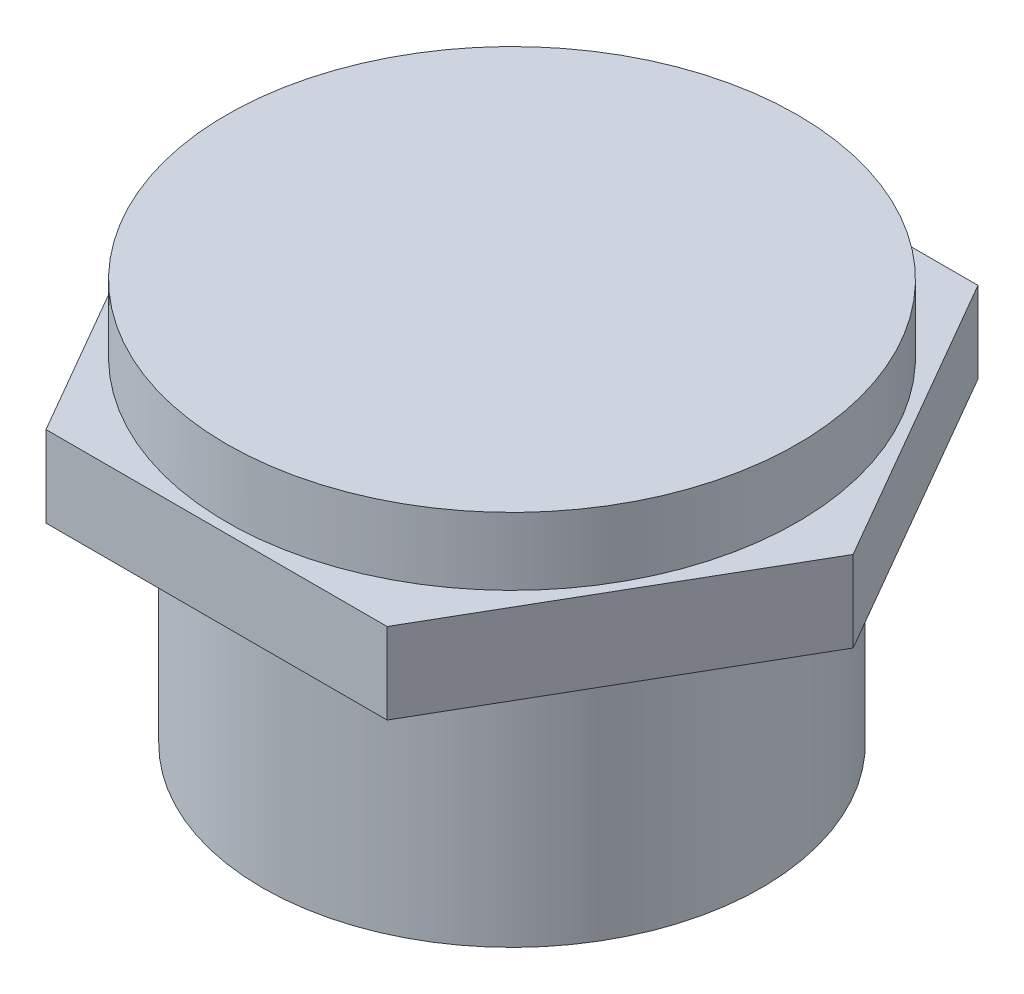
ISO-10303-21;
HEADER;
FILE_DESCRIPTION(('STEP AP214'),'2;1');
FILE_NAME('part.step','',(''),(''),'','','');
FILE_SCHEMA(('AUTOMOTIVE_DESIGN { 1 0 10303 214 1 1 1 1 }'));
ENDSEC;
DATA;
#1=APPLICATION_CONTEXT('core data for automotive mechanical design processes');
#2=APPLICATION_PROTOCOL_DEFINITION('international standard','automotive_design',2000,#1);
#3=PRODUCT_CONTEXT('',#1,'mechanical');
#4=PRODUCT('Part','Part','',(#3));
#5=PRODUCT_RELATED_PRODUCT_CATEGORY('part','',(#4));
#6=PRODUCT_DEFINITION_FORMATION('','',#4);
#7=PRODUCT_DEFINITION_CONTEXT('part definition',#1,'design');
#8=PRODUCT_DEFINITION('design','',#6,#7);
#9=PRODUCT_DEFINITION_SHAPE('','',#8);
#10=(LENGTH_UNIT() NAMED_UNIT(*) SI_UNIT(.MILLI.,.METRE.));
#11=(NAMED_UNIT(*) PLANE_ANGLE_UNIT() SI_UNIT($,.RADIAN.));
#12=(NAMED_UNIT(*) SI_UNIT($,.STERADIAN.) SOLID_ANGLE_UNIT());
#13=UNCERTAINTY_MEASURE_WITH_UNIT(LENGTH_MEASURE(1.E-05),#10,'distance_accuracy_value','');
#14=(GEOMETRIC_REPRESENTATION_CONTEXT(3) GLOBAL_UNCERTAINTY_ASSIGNED_CONTEXT((#13)) GLOBAL_UNIT_ASSIGNED_CONTEXT((#10,
#11,#12)) REPRESENTATION_CONTEXT('',''));
#15=CARTESIAN_POINT('',(0.,0.,0.));
#16=DIRECTION('',(0.,0.,1.));
#17=DIRECTION('',(1.,0.,0.));
#18=AXIS2_PLACEMENT_3D('',#15,#16,#17);
#19=CARTESIAN_POINT('',(0.,2.54,0.));
#20=DIRECTION('',(0.,-1.,0.));
#21=DIRECTION('',(0.,0.,-1.));
#22=AXIS2_PLACEMENT_3D('',#19,#20,#21);
#23=CYLINDRICAL_SURFACE('',#22,10.7315);
#24=CARTESIAN_POINT('',(0.,2.54,0.));
#25=DIRECTION('',(0.,1.,0.));
#26=DIRECTION('',(0.,0.,1.));
#27=AXIS2_PLACEMENT_3D('',#24,#25,#26);
#28=CIRCLE('',#27,10.7315);
#29=CARTESIAN_POINT('',(0.,2.54,10.7315));
#30=VERTEX_POINT('',#29);
#31=EDGE_CURVE('E11',#30,#30,#28,.T.);
#32=ORIENTED_EDGE('',*,*,#31,.F.);
#33=EDGE_LOOP('',(#32));
#34=FACE_BOUND('',#33,.T.);
#35=CARTESIAN_POINT('',(0.,0.,0.));
#36=DIRECTION('',(0.,-1.,0.));
#37=DIRECTION('',(0.,0.,-1.));
#38=AXIS2_PLACEMENT_3D('',#35,#36,#37);
#39=CIRCLE('',#38,10.7315);
#40=CARTESIAN_POINT('',(0.,0.,-10.7315));
#41=VERTEX_POINT('',#40);
#42=EDGE_CURVE('E45',#41,#41,#39,.T.);
#43=ORIENTED_EDGE('',*,*,#42,.F.);
#44=EDGE_LOOP('',(#43));
#45=FACE_BOUND('',#44,.T.);
#46=ADVANCED_FACE('F37',(#34,#45),#23,.T.);
#47=CARTESIAN_POINT('',(0.,2.54,0.));
#48=DIRECTION('',(0.,1.,0.));
#49=DIRECTION('',(0.,0.,1.));
#50=AXIS2_PLACEMENT_3D('',#47,#48,#49);
#51=PLANE('',#50);
#52=ORIENTED_EDGE('',*,*,#31,.T.);
#53=EDGE_LOOP('',(#52));
#54=FACE_BOUND('',#53,.T.);
#55=ADVANCED_FACE('F148',(#54),#51,.T.);
#56=CARTESIAN_POINT('',(-6.41580486636972,-3.048,11.1125));
#57=DIRECTION('',(0.866025403784438,0.,-0.5));
#58=DIRECTION('',(-0.5,0.,-0.866025403784439));
#59=AXIS2_PLACEMENT_3D('',#56,#57,#58);
#60=PLANE('',#59);
#61=DIRECTION('',(-0.5,0.,-0.866025403784438));
#62=VECTOR('',#61,1.);
#63=CARTESIAN_POINT('',(-6.41580486636972,0.,11.1125));
#64=LINE('',#63,#62);
#65=CARTESIAN_POINT('',(-6.41580486636972,0.,11.1125));
#66=VERTEX_POINT('',#65);
#67=CARTESIAN_POINT('',(-12.8316097327394,0.,0.));
#68=VERTEX_POINT('',#67);
#69=EDGE_CURVE('E122',#66,#68,#64,.T.);
#70=ORIENTED_EDGE('',*,*,#69,.T.);
#71=DIRECTION('',(0.,1.,0.));
#72=VECTOR('',#71,1.);
#73=CARTESIAN_POINT('',(-12.8316097327394,-3.048,0.));
#74=LINE('',#73,#72);
#75=CARTESIAN_POINT('',(-12.8316097327394,-3.048,0.));
#76=VERTEX_POINT('',#75);
#77=EDGE_CURVE('E140',#76,#68,#74,.T.);
#78=ORIENTED_EDGE('',*,*,#77,.F.);
#79=DIRECTION('',(-0.5,0.,-0.866025403784438));
#80=VECTOR('',#79,1.);
#81=CARTESIAN_POINT('',(-6.41580486636972,-3.048,11.1125));
#82=LINE('',#81,#80);
#83=CARTESIAN_POINT('',(-6.41580486636972,-3.048,11.1125));
#84=VERTEX_POINT('',#83);
#85=EDGE_CURVE('E133',#84,#76,#82,.T.);
#86=ORIENTED_EDGE('',*,*,#85,.F.);
#87=DIRECTION('',(0.,1.,0.));
#88=VECTOR('',#87,1.);
#89=CARTESIAN_POINT('',(-6.41580486636972,-3.048,11.1125));
#90=LINE('',#89,#88);
#91=EDGE_CURVE('E118',#84,#66,#90,.T.);
#92=ORIENTED_EDGE('',*,*,#91,.T.);
#93=EDGE_LOOP('',(#70,#78,#86,#92));
#94=FACE_BOUND('',#93,.T.);
#95=ADVANCED_FACE('F153',(#94),#60,.F.);
#96=CARTESIAN_POINT('',(-12.8316097327394,-3.048,0.));
#97=DIRECTION('',(0.866025403784439,0.,0.5));
#98=DIRECTION('',(0.5,0.,-0.866025403784439));
#99=AXIS2_PLACEMENT_3D('',#96,#97,#98);
#100=PLANE('',#99);
#101=DIRECTION('',(0.5,0.,-0.866025403784439));
#102=VECTOR('',#101,1.);
#103=CARTESIAN_POINT('',(-12.8316097327394,0.,0.));
#104=LINE('',#103,#102);
#105=CARTESIAN_POINT('',(-6.41580486636972,0.,-11.1125));
#106=VERTEX_POINT('',#105);
#107=EDGE_CURVE('E125',#68,#106,#104,.T.);
#108=ORIENTED_EDGE('',*,*,#107,.T.);
#109=DIRECTION('',(0.,1.,0.));
#110=VECTOR('',#109,1.);
#111=CARTESIAN_POINT('',(-6.41580486636972,-3.048,-11.1125));
#112=LINE('',#111,#110);
#113=CARTESIAN_POINT('',(-6.41580486636972,-3.048,-11.1125));
#114=VERTEX_POINT('',#113);
#115=EDGE_CURVE('E137',#114,#106,#112,.T.);
#116=ORIENTED_EDGE('',*,*,#115,.F.);
#117=DIRECTION('',(0.5,0.,-0.866025403784439));
#118=VECTOR('',#117,1.);
#119=CARTESIAN_POINT('',(-12.8316097327394,-3.048,0.));
#120=LINE('',#119,#118);
#121=EDGE_CURVE('E91',#76,#114,#120,.T.);
#122=ORIENTED_EDGE('',*,*,#121,.F.);
#123=ORIENTED_EDGE('',*,*,#77,.T.);
#124=EDGE_LOOP('',(#108,#116,#122,#123));
#125=FACE_BOUND('',#124,.T.);
#126=ADVANCED_FACE('F159',(#125),#100,.F.);
#127=CARTESIAN_POINT('',(-6.41580486636972,-3.048,-11.1125));
#128=DIRECTION('',(0.,0.,1.));
#129=DIRECTION('',(1.,0.,0.));
#130=AXIS2_PLACEMENT_3D('',#127,#128,#129);
#131=PLANE('',#130);
#132=DIRECTION('',(1.,0.,0.));
#133=VECTOR('',#132,1.);
#134=CARTESIAN_POINT('',(-6.41580486636972,0.,-11.1125));
#135=LINE('',#134,#133);
#136=CARTESIAN_POINT('',(6.41580486636971,0.,-11.1125));
#137=VERTEX_POINT('',#136);
#138=EDGE_CURVE('E128',#106,#137,#135,.T.);
#139=ORIENTED_EDGE('',*,*,#138,.T.);
#140=DIRECTION('',(0.,1.,0.));
#141=VECTOR('',#140,1.);
#142=CARTESIAN_POINT('',(6.41580486636971,-3.048,-11.1125));
#143=LINE('',#142,#141);
#144=CARTESIAN_POINT('',(6.41580486636971,-3.048,-11.1125));
#145=VERTEX_POINT('',#144);
#146=EDGE_CURVE('E113',#145,#137,#143,.T.);
#147=ORIENTED_EDGE('',*,*,#146,.F.);
#148=DIRECTION('',(1.,0.,0.));
#149=VECTOR('',#148,1.);
#150=CARTESIAN_POINT('',(-6.41580486636972,-3.048,-11.1125));
#151=LINE('',#150,#149);
#152=EDGE_CURVE('E104',#114,#145,#151,.T.);
#153=ORIENTED_EDGE('',*,*,#152,.F.);
#154=ORIENTED_EDGE('',*,*,#115,.T.);
#155=EDGE_LOOP('',(#139,#147,#153,#154));
#156=FACE_BOUND('',#155,.T.);
#157=ADVANCED_FACE('F165',(#156),#131,.F.);
#158=CARTESIAN_POINT('',(6.41580486636971,-3.048,-11.1125));
#159=DIRECTION('',(-0.866025403784439,0.,0.5));
#160=DIRECTION('',(0.5,0.,0.866025403784439));
#161=AXIS2_PLACEMENT_3D('',#158,#159,#160);
#162=PLANE('',#161);
#163=DIRECTION('',(0.5,0.,0.866025403784439));
#164=VECTOR('',#163,1.);
#165=CARTESIAN_POINT('',(6.41580486636971,0.,-11.1125));
#166=LINE('',#165,#164);
#167=CARTESIAN_POINT('',(12.8316097327394,0.,0.));
#168=VERTEX_POINT('',#167);
#169=EDGE_CURVE('E112',#137,#168,#166,.T.);
#170=ORIENTED_EDGE('',*,*,#169,.T.);
#171=DIRECTION('',(0.,1.,0.));
#172=VECTOR('',#171,1.);
#173=CARTESIAN_POINT('',(12.8316097327394,-3.048,0.));
#174=LINE('',#173,#172);
#175=CARTESIAN_POINT('',(12.8316097327394,-3.048,0.));
#176=VERTEX_POINT('',#175);
#177=EDGE_CURVE('E109',#176,#168,#174,.T.);
#178=ORIENTED_EDGE('',*,*,#177,.F.);
#179=DIRECTION('',(0.5,0.,0.866025403784439));
#180=VECTOR('',#179,1.);
#181=CARTESIAN_POINT('',(6.41580486636971,-3.048,-11.1125));
#182=LINE('',#181,#180);
#183=EDGE_CURVE('E98',#145,#176,#182,.T.);
#184=ORIENTED_EDGE('',*,*,#183,.F.);
#185=ORIENTED_EDGE('',*,*,#146,.T.);
#186=EDGE_LOOP('',(#170,#178,#184,#185));
#187=FACE_BOUND('',#186,.T.);
#188=ADVANCED_FACE('F110',(#187),#162,.F.);
#189=CARTESIAN_POINT('',(12.8316097327394,-3.048,0.));
#190=DIRECTION('',(-0.866025403784439,0.,-0.5));
#191=DIRECTION('',(-0.5,0.,0.866025403784439));
#192=AXIS2_PLACEMENT_3D('',#189,#190,#191);
#193=PLANE('',#192);
#194=DIRECTION('',(-0.5,0.,0.866025403784439));
#195=VECTOR('',#194,1.);
#196=CARTESIAN_POINT('',(12.8316097327394,0.,0.));
#197=LINE('',#196,#195);
#198=CARTESIAN_POINT('',(6.41580486636972,0.,11.1125));
#199=VERTEX_POINT('',#198);
#200=EDGE_CURVE('E76',#168,#199,#197,.T.);
#201=ORIENTED_EDGE('',*,*,#200,.T.);
#202=DIRECTION('',(0.,1.,0.));
#203=VECTOR('',#202,1.);
#204=CARTESIAN_POINT('',(6.41580486636972,-3.048,11.1125));
#205=LINE('',#204,#203);
#206=CARTESIAN_POINT('',(6.41580486636972,-3.048,11.1125));
#207=VERTEX_POINT('',#206);
#208=EDGE_CURVE('E114',#207,#199,#205,.T.);
#209=ORIENTED_EDGE('',*,*,#208,.F.);
#210=DIRECTION('',(-0.5,0.,0.866025403784439));
#211=VECTOR('',#210,1.);
#212=CARTESIAN_POINT('',(12.8316097327394,-3.048,0.));
#213=LINE('',#212,#211);
#214=EDGE_CURVE('E102',#176,#207,#213,.T.);
#215=ORIENTED_EDGE('',*,*,#214,.F.);
#216=ORIENTED_EDGE('',*,*,#177,.T.);
#217=EDGE_LOOP('',(#201,#209,#215,#216));
#218=FACE_BOUND('',#217,.T.);
#219=ADVANCED_FACE('F116',(#218),#193,.F.);
#220=CARTESIAN_POINT('',(6.41580486636972,-3.048,11.1125));
#221=DIRECTION('',(0.,0.,-1.));
#222=DIRECTION('',(-1.,0.,0.));
#223=AXIS2_PLACEMENT_3D('',#220,#221,#222);
#224=PLANE('',#223);
#225=DIRECTION('',(-1.,0.,0.));
#226=VECTOR('',#225,1.);
#227=CARTESIAN_POINT('',(6.41580486636972,0.,11.1125));
#228=LINE('',#227,#226);
#229=EDGE_CURVE('E82',#199,#66,#228,.T.);
#230=ORIENTED_EDGE('',*,*,#229,.T.);
#231=ORIENTED_EDGE('',*,*,#91,.F.);
#232=DIRECTION('',(-1.,0.,0.));
#233=VECTOR('',#232,1.);
#234=CARTESIAN_POINT('',(6.41580486636972,-3.048,11.1125));
#235=LINE('',#234,#233);
#236=EDGE_CURVE('E53',#207,#84,#235,.T.);
#237=ORIENTED_EDGE('',*,*,#236,.F.);
#238=ORIENTED_EDGE('',*,*,#208,.T.);
#239=EDGE_LOOP('',(#230,#231,#237,#238));
#240=FACE_BOUND('',#239,.T.);
#241=ADVANCED_FACE('F173',(#240),#224,.F.);
#242=CARTESIAN_POINT('',(0.,-3.048,0.));
#243=DIRECTION('',(0.,-1.,0.));
#244=DIRECTION('',(0.,0.,-1.));
#245=AXIS2_PLACEMENT_3D('',#242,#243,#244);
#246=PLANE('',#245);
#247=CARTESIAN_POINT('',(0.,-3.048,0.));
#248=DIRECTION('',(0.,-1.,0.));
#249=DIRECTION('',(0.,0.,-1.));
#250=AXIS2_PLACEMENT_3D('',#247,#248,#249);
#251=CIRCLE('',#250,9.398);
#252=CARTESIAN_POINT('',(0.,-3.048,9.398));
#253=VERTEX_POINT('',#252);
#254=EDGE_CURVE('E192',#253,#253,#251,.T.);
#255=ORIENTED_EDGE('',*,*,#254,.F.);
#256=EDGE_LOOP('',(#255));
#257=FACE_BOUND('',#256,.T.);
#258=ORIENTED_EDGE('',*,*,#85,.T.);
#259=ORIENTED_EDGE('',*,*,#121,.T.);
#260=ORIENTED_EDGE('',*,*,#152,.T.);
#261=ORIENTED_EDGE('',*,*,#183,.T.);
#262=ORIENTED_EDGE('',*,*,#214,.T.);
#263=ORIENTED_EDGE('',*,*,#236,.T.);
#264=EDGE_LOOP('',(#258,#259,#260,#261,#262,#263));
#265=FACE_BOUND('',#264,.T.);
#266=ADVANCED_FACE('F100',(#257,#265),#246,.T.);
#267=CARTESIAN_POINT('',(0.,0.,0.));
#268=DIRECTION('',(0.,-1.,0.));
#269=DIRECTION('',(0.,0.,-1.));
#270=AXIS2_PLACEMENT_3D('',#267,#268,#269);
#271=PLANE('',#270);
#272=ORIENTED_EDGE('',*,*,#42,.T.);
#273=EDGE_LOOP('',(#272));
#274=FACE_BOUND('',#273,.T.);
#275=ORIENTED_EDGE('',*,*,#69,.F.);
#276=ORIENTED_EDGE('',*,*,#229,.F.);
#277=ORIENTED_EDGE('',*,*,#200,.F.);
#278=ORIENTED_EDGE('',*,*,#169,.F.);
#279=ORIENTED_EDGE('',*,*,#138,.F.);
#280=ORIENTED_EDGE('',*,*,#107,.F.);
#281=EDGE_LOOP('',(#275,#276,#277,#278,#279,#280));
#282=FACE_BOUND('',#281,.T.);
#283=ADVANCED_FACE('F144',(#274,#282),#271,.F.);
#284=CARTESIAN_POINT('',(0.,-12.573,0.));
#285=DIRECTION('',(0.,1.,0.));
#286=DIRECTION('',(0.,0.,1.));
#287=AXIS2_PLACEMENT_3D('',#284,#285,#286);
#288=CYLINDRICAL_SURFACE('',#287,9.398);
#289=CARTESIAN_POINT('',(0.,-12.573,0.));
#290=DIRECTION('',(0.,-1.,0.));
#291=DIRECTION('',(0.,0.,-1.));
#292=AXIS2_PLACEMENT_3D('',#289,#290,#291);
#293=CIRCLE('',#292,9.398);
#294=CARTESIAN_POINT('',(0.,-12.573,9.398));
#295=VERTEX_POINT('',#294);
#296=EDGE_CURVE('E126',#295,#295,#293,.T.);
#297=CARTESIAN_POINT('',(0.,-12.573,9.398));
#298=CARTESIAN_POINT('',(0.,-12.47378125,9.398));
#299=CARTESIAN_POINT('',(0.,-12.3745625,9.398));
#300=CARTESIAN_POINT('',(0.,-12.176125,9.398));
#301=CARTESIAN_POINT('',(0.,-12.07690625,9.398));
#302=CARTESIAN_POINT('',(0.,-11.87846875,9.398));
#303=CARTESIAN_POINT('',(0.,-11.77925,9.398));
#304=CARTESIAN_POINT('',(0.,-11.5808125,9.398));
#305=CARTESIAN_POINT('',(0.,-11.48159375,9.398));
#306=CARTESIAN_POINT('',(0.,-11.28315625,9.398));
#307=CARTESIAN_POINT('',(0.,-11.1839375,9.398));
#308=CARTESIAN_POINT('',(0.,-10.9855,9.398));
#309=CARTESIAN_POINT('',(0.,-10.88628125,9.398));
#310=CARTESIAN_POINT('',(0.,-10.68784375,9.398));
#311=CARTESIAN_POINT('',(0.,-10.588625,9.398));
#312=CARTESIAN_POINT('',(0.,-10.3901875,9.398));
#313=CARTESIAN_POINT('',(0.,-10.29096875,9.398));
#314=CARTESIAN_POINT('',(0.,-10.09253125,9.398));
#315=CARTESIAN_POINT('',(0.,-9.9933125,9.398));
#316=CARTESIAN_POINT('',(0.,-9.794875,9.398));
#317=CARTESIAN_POINT('',(0.,-9.69565625,9.398));
#318=CARTESIAN_POINT('',(0.,-9.49721875,9.398));
#319=CARTESIAN_POINT('',(0.,-9.398,9.398));
#320=CARTESIAN_POINT('',(0.,-9.1995625,9.398));
#321=CARTESIAN_POINT('',(0.,-9.10034375,9.398));
#322=CARTESIAN_POINT('',(0.,-8.90190625,9.398));
#323=CARTESIAN_POINT('',(0.,-8.8026875,9.398));
#324=CARTESIAN_POINT('',(0.,-8.60425,9.398));
#325=CARTESIAN_POINT('',(0.,-8.50503125,9.398));
#326=CARTESIAN_POINT('',(0.,-8.30659375,9.398));
#327=CARTESIAN_POINT('',(0.,-8.207375,9.398));
#328=CARTESIAN_POINT('',(0.,-8.0089375,9.398));
#329=CARTESIAN_POINT('',(0.,-7.90971875,9.398));
#330=CARTESIAN_POINT('',(0.,-7.71128125,9.398));
#331=CARTESIAN_POINT('',(0.,-7.6120625,9.398));
#332=CARTESIAN_POINT('',(0.,-7.413625,9.398));
#333=CARTESIAN_POINT('',(0.,-7.31440625,9.398));
#334=CARTESIAN_POINT('',(0.,-7.11596875,9.398));
#335=CARTESIAN_POINT('',(0.,-7.01675,9.398));
#336=CARTESIAN_POINT('',(0.,-6.8183125,9.398));
#337=CARTESIAN_POINT('',(0.,-6.71909375,9.398));
#338=CARTESIAN_POINT('',(0.,-6.52065625,9.398));
#339=CARTESIAN_POINT('',(0.,-6.4214375,9.398));
#340=CARTESIAN_POINT('',(0.,-6.223,9.398));
#341=CARTESIAN_POINT('',(0.,-6.12378125,9.398));
#342=CARTESIAN_POINT('',(0.,-5.92534375,9.398));
#343=CARTESIAN_POINT('',(0.,-5.826125,9.398));
#344=CARTESIAN_POINT('',(0.,-5.6276875,9.398));
#345=CARTESIAN_POINT('',(0.,-5.52846875,9.398));
#346=CARTESIAN_POINT('',(0.,-5.33003125,9.398));
#347=CARTESIAN_POINT('',(0.,-5.2308125,9.398));
#348=CARTESIAN_POINT('',(0.,-5.032375,9.398));
#349=CARTESIAN_POINT('',(0.,-4.93315625,9.398));
#350=CARTESIAN_POINT('',(0.,-4.73471875,9.398));
#351=CARTESIAN_POINT('',(0.,-4.6355,9.398));
#352=CARTESIAN_POINT('',(0.,-4.4370625,9.398));
#353=CARTESIAN_POINT('',(0.,-4.33784375,9.398));
#354=CARTESIAN_POINT('',(0.,-4.13940625,9.398));
#355=CARTESIAN_POINT('',(0.,-4.0401875,9.398));
#356=CARTESIAN_POINT('',(0.,-3.84175,9.398));
#357=CARTESIAN_POINT('',(0.,-3.74253125,9.398));
#358=CARTESIAN_POINT('',(0.,-3.54409375,9.398));
#359=CARTESIAN_POINT('',(0.,-3.444875,9.398));
#360=CARTESIAN_POINT('',(0.,-3.2464375,9.398));
#361=CARTESIAN_POINT('',(0.,-3.14721875,9.398));
#362=CARTESIAN_POINT('',(0.,-3.048,9.398));
#363=B_SPLINE_CURVE_WITH_KNOTS('',3,(#297,#298,#299,#300,#301,#302,#303,#304,#305,#306,#307,
#308,#309,#310,#311,#312,#313,#314,#315,#316,#317,#318,#319,#320,#321,#322,#323,#324,#325,#326,
#327,#328,#329,#330,#331,#332,#333,#334,#335,#336,#337,#338,#339,#340,#341,#342,#343,#344,#345,
#346,#347,#348,#349,#350,#351,#352,#353,#354,#355,#356,#357,#358,#359,#360,#361,#362),
.UNSPECIFIED.,.F.,.F.,(4,2,2,2,2,2,2,2,2,2,2,2,2,2,2,2,2,2,2,2,2,2,2,2,2,2,2,2,2,2,2,2,4),(0.,
0.29765625,0.5953125,0.892968750000001,1.190625,1.48828125,1.7859375,2.08359375,2.38125,
2.67890625,2.9765625,3.27421875,3.571875,3.86953125,4.1671875,4.46484375,4.7625,5.06015625,
5.3578125,5.65546875,5.953125,6.25078125,6.5484375,6.84609375,7.14375,7.44140625,7.7390625,
8.03671875,8.334375,8.63203125,8.9296875,9.22734375,9.525),.UNSPECIFIED.);
#364=EDGE_CURVE('BSEAM178',#295,#253,#363,.T.);
#365=ORIENTED_EDGE('',*,*,#296,.F.);
#366=ORIENTED_EDGE('',*,*,#254,.T.);
#367=ORIENTED_EDGE('',*,*,#364,.T.);
#368=ORIENTED_EDGE('',*,*,#364,.F.);
#369=EDGE_LOOP('',(#365,#367,#366,#368));
#370=FACE_BOUND('',#369,.T.);
#371=ADVANCED_FACE('F178',(#370),#288,.T.);
#372=CARTESIAN_POINT('',(0.,-12.573,0.));
#373=DIRECTION('',(0.,-1.,0.));
#374=DIRECTION('',(0.,0.,-1.));
#375=AXIS2_PLACEMENT_3D('',#372,#373,#374);
#376=PLANE('',#375);
#377=ORIENTED_EDGE('',*,*,#296,.T.);
#378=EDGE_LOOP('',(#377));
#379=FACE_BOUND('',#378,.T.);
#380=ADVANCED_FACE('F184',(#379),#376,.T.);
#381=CLOSED_SHELL('',(#46,#55,#95,#126,#157,#188,#219,#241,#266,#283,#371,#380));
#382=MANIFOLD_SOLID_BREP('B2',#381);
#383=ADVANCED_BREP_SHAPE_REPRESENTATION('',(#18,#382),#14);
#384=SHAPE_DEFINITION_REPRESENTATION(#9,#383);
ENDSEC;
END-ISO-10303-21;
